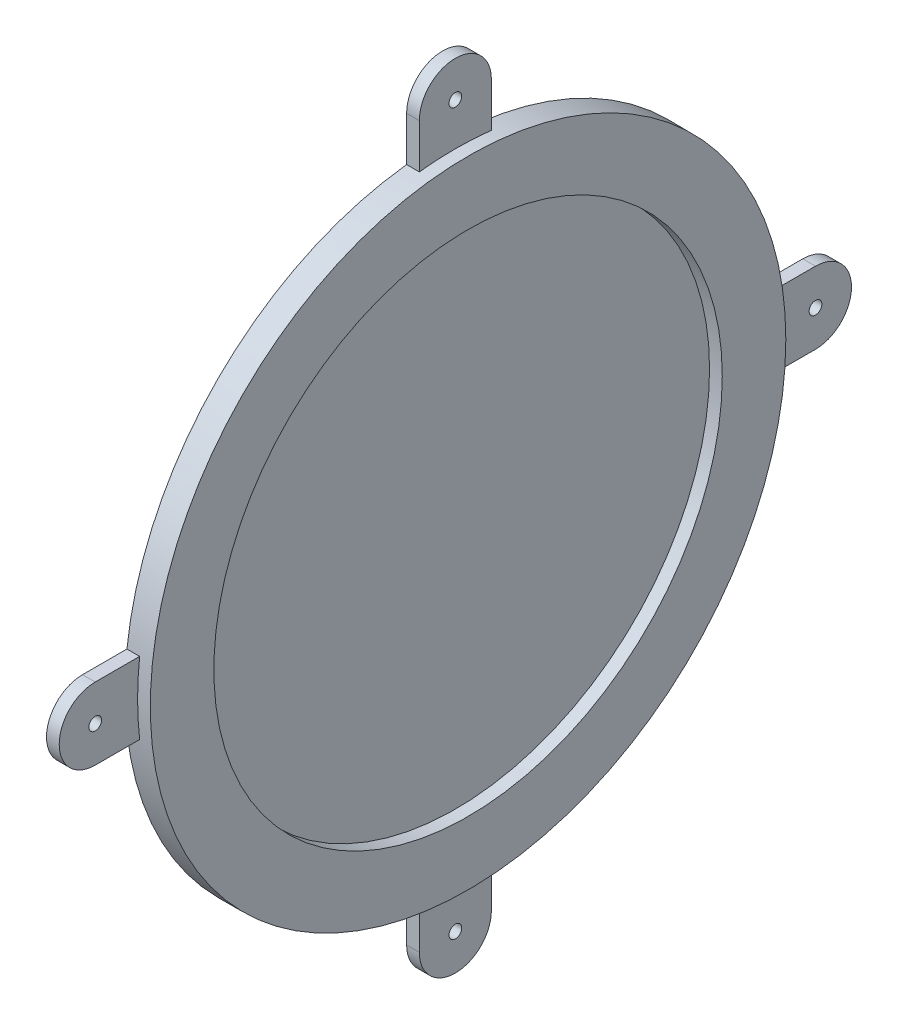
ISO-10303-21;
HEADER;
FILE_DESCRIPTION(('STEP AP214'),'2;1');
FILE_NAME('part.step','',(''),(''),'','','');
FILE_SCHEMA(('AUTOMOTIVE_DESIGN { 1 0 10303 214 1 1 1 1 }'));
ENDSEC;
DATA;
#1=APPLICATION_CONTEXT('core data for automotive mechanical design processes');
#2=APPLICATION_PROTOCOL_DEFINITION('international standard','automotive_design',2000,#1);
#3=PRODUCT_CONTEXT('',#1,'mechanical');
#4=PRODUCT('Part','Part','',(#3));
#5=PRODUCT_RELATED_PRODUCT_CATEGORY('part','',(#4));
#6=PRODUCT_DEFINITION_FORMATION('','',#4);
#7=PRODUCT_DEFINITION_CONTEXT('part definition',#1,'design');
#8=PRODUCT_DEFINITION('design','',#6,#7);
#9=PRODUCT_DEFINITION_SHAPE('','',#8);
#10=(LENGTH_UNIT() NAMED_UNIT(*) SI_UNIT(.MILLI.,.METRE.));
#11=(NAMED_UNIT(*) PLANE_ANGLE_UNIT() SI_UNIT($,.RADIAN.));
#12=(NAMED_UNIT(*) SI_UNIT($,.STERADIAN.) SOLID_ANGLE_UNIT());
#13=UNCERTAINTY_MEASURE_WITH_UNIT(LENGTH_MEASURE(1.E-05),#10,'distance_accuracy_value','');
#14=(GEOMETRIC_REPRESENTATION_CONTEXT(3) GLOBAL_UNCERTAINTY_ASSIGNED_CONTEXT((#13)) GLOBAL_UNIT_ASSIGNED_CONTEXT((#10,
#11,#12)) REPRESENTATION_CONTEXT('',''));
#15=CARTESIAN_POINT('',(0.,0.,0.));
#16=DIRECTION('',(0.,0.,1.));
#17=DIRECTION('',(1.,0.,0.));
#18=AXIS2_PLACEMENT_3D('',#15,#16,#17);
#19=CARTESIAN_POINT('',(3.,0.,0.));
#20=DIRECTION('',(1.,0.,0.));
#21=DIRECTION('',(0.,0.,-1.));
#22=AXIS2_PLACEMENT_3D('',#19,#20,#21);
#23=PLANE('',#22);
#24=CARTESIAN_POINT('',(3.,0.,0.));
#25=DIRECTION('',(1.,0.,0.));
#26=DIRECTION('',(0.,0.,-1.));
#27=AXIS2_PLACEMENT_3D('',#24,#25,#26);
#28=CIRCLE('',#27,75.0000000000023);
#29=CARTESIAN_POINT('',(3.,74.5167766345271,-8.5));
#30=VERTEX_POINT('',#29);
#31=CARTESIAN_POINT('',(3.,74.5167766345271,8.5));
#32=VERTEX_POINT('',#31);
#33=EDGE_CURVE('E11',#30,#32,#28,.T.);
#34=ORIENTED_EDGE('',*,*,#33,.F.);
#35=DIRECTION('',(0.,-1.,0.));
#36=VECTOR('',#35,1.);
#37=CARTESIAN_POINT('',(3.,-4.89478461256207E-13,-8.49999999999571));
#38=LINE('',#37,#36);
#39=CARTESIAN_POINT('',(3.,85.,-8.50000000000061));
#40=VERTEX_POINT('',#39);
#41=EDGE_CURVE('E248',#40,#30,#38,.T.);
#42=ORIENTED_EDGE('',*,*,#41,.F.);
#43=CARTESIAN_POINT('',(3.,85.,-5.98756576499627E-13));
#44=DIRECTION('',(1.,0.,0.));
#45=DIRECTION('',(0.,0.,-1.));
#46=AXIS2_PLACEMENT_3D('',#43,#44,#45);
#47=CIRCLE('',#46,8.5000000000003);
#48=CARTESIAN_POINT('',(3.,85.,8.5));
#49=VERTEX_POINT('',#48);
#50=EDGE_CURVE('E297',#40,#49,#47,.T.);
#51=ORIENTED_EDGE('',*,*,#50,.T.);
#52=DIRECTION('',(0.,-1.,0.));
#53=VECTOR('',#52,1.);
#54=CARTESIAN_POINT('',(3.,0.,8.5));
#55=LINE('',#54,#53);
#56=EDGE_CURVE('E295',#49,#32,#55,.T.);
#57=ORIENTED_EDGE('',*,*,#56,.T.);
#58=EDGE_LOOP('',(#34,#42,#51,#57));
#59=FACE_BOUND('',#58,.T.);
#60=CARTESIAN_POINT('',(3.,85.,-5.98756576499627E-13));
#61=DIRECTION('',(1.,0.,0.));
#62=DIRECTION('',(0.,0.,-1.));
#63=AXIS2_PLACEMENT_3D('',#60,#61,#62);
#64=CIRCLE('',#63,1.49999999999943);
#65=CARTESIAN_POINT('',(3.,85.,-1.50000000000003));
#66=VERTEX_POINT('',#65);
#67=EDGE_CURVE('E198',#66,#66,#64,.T.);
#68=ORIENTED_EDGE('',*,*,#67,.F.);
#69=EDGE_LOOP('',(#68));
#70=FACE_BOUND('',#69,.T.);
#71=ADVANCED_FACE('F38',(#59,#70),#23,.T.);
#72=CARTESIAN_POINT('',(3.,8.49999999999278,74.5167766345232));
#73=VERTEX_POINT('',#72);
#74=CARTESIAN_POINT('',(3.,-8.50000000000815,74.5167766345224));
#75=VERTEX_POINT('',#74);
#76=EDGE_CURVE('E48',#73,#75,#28,.T.);
#77=ORIENTED_EDGE('',*,*,#76,.F.);
#78=DIRECTION('',(0.,0.,-1.));
#79=VECTOR('',#78,1.);
#80=CARTESIAN_POINT('',(3.,8.49999999999213,0.));
#81=LINE('',#80,#79);
#82=CARTESIAN_POINT('',(3.,8.49999999999227,84.9999999999917));
#83=VERTEX_POINT('',#82);
#84=EDGE_CURVE('E296',#83,#73,#81,.T.);
#85=ORIENTED_EDGE('',*,*,#84,.F.);
#86=CARTESIAN_POINT('',(3.,-7.73818798504058E-12,84.9999999999917));
#87=DIRECTION('',(1.,0.,0.));
#88=DIRECTION('',(0.,0.,-1.));
#89=AXIS2_PLACEMENT_3D('',#86,#87,#88);
#90=CIRCLE('',#89,8.49999999999999);
#91=CARTESIAN_POINT('',(3.,-8.50000000000771,84.9999999999917));
#92=VERTEX_POINT('',#91);
#93=EDGE_CURVE('E300',#83,#92,#90,.T.);
#94=ORIENTED_EDGE('',*,*,#93,.T.);
#95=DIRECTION('',(0.,0.,-1.));
#96=VECTOR('',#95,1.);
#97=CARTESIAN_POINT('',(3.,-8.50000000000786,0.));
#98=LINE('',#97,#96);
#99=EDGE_CURVE('E306',#92,#75,#98,.T.);
#100=ORIENTED_EDGE('',*,*,#99,.T.);
#101=EDGE_LOOP('',(#77,#85,#94,#100));
#102=FACE_BOUND('',#101,.T.);
#103=CARTESIAN_POINT('',(3.,-7.73818798504058E-12,84.9999999999917));
#104=DIRECTION('',(1.,0.,0.));
#105=DIRECTION('',(0.,0.,-1.));
#106=AXIS2_PLACEMENT_3D('',#103,#104,#105);
#107=CIRCLE('',#106,1.50000000001069);
#108=CARTESIAN_POINT('',(3.,-7.73818798504058E-12,83.499999999981));
#109=VERTEX_POINT('',#108);
#110=EDGE_CURVE('E195',#109,#109,#107,.T.);
#111=ORIENTED_EDGE('',*,*,#110,.F.);
#112=EDGE_LOOP('',(#111));
#113=FACE_BOUND('',#112,.T.);
#114=ADVANCED_FACE('F354',(#102,#113),#23,.T.);
#115=CARTESIAN_POINT('',(3.,-74.5167766345279,8.49999999998404));
#116=VERTEX_POINT('',#115);
#117=CARTESIAN_POINT('',(3.,-74.5167766345262,-8.50000000001596));
#118=VERTEX_POINT('',#117);
#119=EDGE_CURVE('E169',#116,#118,#28,.T.);
#120=ORIENTED_EDGE('',*,*,#119,.F.);
#121=DIRECTION('',(0.,1.,0.));
#122=VECTOR('',#121,1.);
#123=CARTESIAN_POINT('',(3.,0.,8.4999999999838));
#124=LINE('',#123,#122);
#125=CARTESIAN_POINT('',(3.,-85.,8.49999999998394));
#126=VERTEX_POINT('',#125);
#127=EDGE_CURVE('E308',#126,#116,#124,.T.);
#128=ORIENTED_EDGE('',*,*,#127,.F.);
#129=CARTESIAN_POINT('',(3.,-85.,-1.60649982906703E-11));
#130=DIRECTION('',(1.,0.,0.));
#131=DIRECTION('',(0.,0.,-1.));
#132=AXIS2_PLACEMENT_3D('',#129,#130,#131);
#133=CIRCLE('',#132,8.49999999999999);
#134=CARTESIAN_POINT('',(3.,-85.,-8.50000000001604));
#135=VERTEX_POINT('',#134);
#136=EDGE_CURVE('E187',#126,#135,#133,.T.);
#137=ORIENTED_EDGE('',*,*,#136,.T.);
#138=DIRECTION('',(0.,1.,0.));
#139=VECTOR('',#138,1.);
#140=CARTESIAN_POINT('',(3.,0.,-8.5000000000162));
#141=LINE('',#140,#139);
#142=EDGE_CURVE('E184',#135,#118,#141,.T.);
#143=ORIENTED_EDGE('',*,*,#142,.T.);
#144=EDGE_LOOP('',(#120,#128,#137,#143));
#145=FACE_BOUND('',#144,.T.);
#146=CARTESIAN_POINT('',(3.,-85.,-1.60649982906703E-11));
#147=DIRECTION('',(1.,0.,0.));
#148=DIRECTION('',(0.,0.,-1.));
#149=AXIS2_PLACEMENT_3D('',#146,#147,#148);
#150=CIRCLE('',#149,1.50000000001593);
#151=CARTESIAN_POINT('',(3.,-85.,-1.500000000032));
#152=VERTEX_POINT('',#151);
#153=EDGE_CURVE('E192',#152,#152,#150,.T.);
#154=ORIENTED_EDGE('',*,*,#153,.F.);
#155=EDGE_LOOP('',(#154));
#156=FACE_BOUND('',#155,.T.);
#157=ADVANCED_FACE('F314',(#145,#156),#23,.T.);
#158=CARTESIAN_POINT('',(3.,-4.89478461256207E-13,-8.49999999999571));
#159=DIRECTION('',(0.,0.,-1.));
#160=DIRECTION('',(0.,1.,0.));
#161=AXIS2_PLACEMENT_3D('',#158,#159,#160);
#162=PLANE('',#161);
#163=DIRECTION('',(0.,-1.,0.));
#164=VECTOR('',#163,1.);
#165=CARTESIAN_POINT('',(0.,-4.89478461256207E-13,-8.49999999999571));
#166=LINE('',#165,#164);
#167=CARTESIAN_POINT('',(0.,85.,-8.50000000000061));
#168=VERTEX_POINT('',#167);
#169=CARTESIAN_POINT('',(0.,74.5167766345271,-8.5));
#170=VERTEX_POINT('',#169);
#171=EDGE_CURVE('E208',#168,#170,#166,.T.);
#172=ORIENTED_EDGE('',*,*,#171,.F.);
#173=DIRECTION('',(-1.,0.,0.));
#174=VECTOR('',#173,1.);
#175=CARTESIAN_POINT('',(3.,85.,-8.50000000000061));
#176=LINE('',#175,#174);
#177=EDGE_CURVE('E276',#40,#168,#176,.T.);
#178=ORIENTED_EDGE('',*,*,#177,.F.);
#179=ORIENTED_EDGE('',*,*,#41,.T.);
#180=DIRECTION('',(-1.,0.,0.));
#181=VECTOR('',#180,1.);
#182=CARTESIAN_POINT('',(3.,74.5167766345271,-8.5));
#183=LINE('',#182,#181);
#184=EDGE_CURVE('E42',#30,#170,#183,.T.);
#185=ORIENTED_EDGE('',*,*,#184,.T.);
#186=EDGE_LOOP('',(#172,#178,#179,#185));
#187=FACE_BOUND('',#186,.T.);
#188=ADVANCED_FACE('F40',(#187),#162,.T.);
#189=CARTESIAN_POINT('',(3.,85.,-5.98756576499627E-13));
#190=DIRECTION('',(-1.,0.,0.));
#191=DIRECTION('',(0.,0.,1.));
#192=AXIS2_PLACEMENT_3D('',#189,#190,#191);
#193=CYLINDRICAL_SURFACE('',#192,8.5000000000003);
#194=CARTESIAN_POINT('',(0.,85.,-5.98756576499627E-13));
#195=DIRECTION('',(1.,0.,0.));
#196=DIRECTION('',(0.,0.,-1.));
#197=AXIS2_PLACEMENT_3D('',#194,#195,#196);
#198=CIRCLE('',#197,8.5000000000003);
#199=CARTESIAN_POINT('',(0.,85.,8.5));
#200=VERTEX_POINT('',#199);
#201=EDGE_CURVE('E213',#168,#200,#198,.T.);
#202=ORIENTED_EDGE('',*,*,#201,.T.);
#203=DIRECTION('',(-1.,0.,0.));
#204=VECTOR('',#203,1.);
#205=CARTESIAN_POINT('',(3.,85.,8.5));
#206=LINE('',#205,#204);
#207=EDGE_CURVE('E274',#49,#200,#206,.T.);
#208=ORIENTED_EDGE('',*,*,#207,.F.);
#209=ORIENTED_EDGE('',*,*,#50,.F.);
#210=ORIENTED_EDGE('',*,*,#177,.T.);
#211=EDGE_LOOP('',(#202,#208,#209,#210));
#212=FACE_BOUND('',#211,.T.);
#213=ADVANCED_FACE('F290',(#212),#193,.T.);
#214=CARTESIAN_POINT('',(3.,0.,8.5));
#215=DIRECTION('',(0.,0.,-1.));
#216=DIRECTION('',(-1.,0.,0.));
#217=AXIS2_PLACEMENT_3D('',#214,#215,#216);
#218=PLANE('',#217);
#219=DIRECTION('',(0.,-1.,0.));
#220=VECTOR('',#219,1.);
#221=CARTESIAN_POINT('',(0.,0.,8.5));
#222=LINE('',#221,#220);
#223=CARTESIAN_POINT('',(0.,74.5167766345271,8.5));
#224=VERTEX_POINT('',#223);
#225=EDGE_CURVE('E215',#200,#224,#222,.T.);
#226=ORIENTED_EDGE('',*,*,#225,.T.);
#227=DIRECTION('',(-1.,0.,0.));
#228=VECTOR('',#227,1.);
#229=CARTESIAN_POINT('',(3.,74.5167766345271,8.5));
#230=LINE('',#229,#228);
#231=EDGE_CURVE('E271',#32,#224,#230,.T.);
#232=ORIENTED_EDGE('',*,*,#231,.F.);
#233=ORIENTED_EDGE('',*,*,#56,.F.);
#234=ORIENTED_EDGE('',*,*,#207,.T.);
#235=EDGE_LOOP('',(#226,#232,#233,#234));
#236=FACE_BOUND('',#235,.T.);
#237=ADVANCED_FACE('F293',(#236),#218,.F.);
#238=CARTESIAN_POINT('',(3.,8.49999999999213,0.));
#239=DIRECTION('',(0.,1.,0.));
#240=DIRECTION('',(0.,0.,1.));
#241=AXIS2_PLACEMENT_3D('',#238,#239,#240);
#242=PLANE('',#241);
#243=DIRECTION('',(0.,0.,-1.));
#244=VECTOR('',#243,1.);
#245=CARTESIAN_POINT('',(0.,8.49999999999213,0.));
#246=LINE('',#245,#244);
#247=CARTESIAN_POINT('',(0.,8.49999999999227,84.9999999999917));
#248=VERTEX_POINT('',#247);
#249=CARTESIAN_POINT('',(0.,8.49999999999278,74.5167766345232));
#250=VERTEX_POINT('',#249);
#251=EDGE_CURVE('E217',#248,#250,#246,.T.);
#252=ORIENTED_EDGE('',*,*,#251,.F.);
#253=DIRECTION('',(-1.,0.,0.));
#254=VECTOR('',#253,1.);
#255=CARTESIAN_POINT('',(3.,8.49999999999227,84.9999999999917));
#256=LINE('',#255,#254);
#257=EDGE_CURVE('E267',#83,#248,#256,.T.);
#258=ORIENTED_EDGE('',*,*,#257,.F.);
#259=ORIENTED_EDGE('',*,*,#84,.T.);
#260=DIRECTION('',(-1.,0.,0.));
#261=VECTOR('',#260,1.);
#262=CARTESIAN_POINT('',(3.,8.49999999999278,74.5167766345232));
#263=LINE('',#262,#261);
#264=EDGE_CURVE('E269',#73,#250,#263,.T.);
#265=ORIENTED_EDGE('',*,*,#264,.T.);
#266=EDGE_LOOP('',(#252,#258,#259,#265));
#267=FACE_BOUND('',#266,.T.);
#268=ADVANCED_FACE('F382',(#267),#242,.T.);
#269=CARTESIAN_POINT('',(3.,-7.73818798504058E-12,84.9999999999917));
#270=DIRECTION('',(-1.,0.,0.));
#271=DIRECTION('',(0.,0.,1.));
#272=AXIS2_PLACEMENT_3D('',#269,#270,#271);
#273=CYLINDRICAL_SURFACE('',#272,8.49999999999999);
#274=CARTESIAN_POINT('',(0.,-7.73818798504058E-12,84.9999999999917));
#275=DIRECTION('',(1.,0.,0.));
#276=DIRECTION('',(0.,0.,-1.));
#277=AXIS2_PLACEMENT_3D('',#274,#275,#276);
#278=CIRCLE('',#277,8.49999999999999);
#279=CARTESIAN_POINT('',(0.,-8.50000000000771,84.9999999999917));
#280=VERTEX_POINT('',#279);
#281=EDGE_CURVE('E220',#248,#280,#278,.T.);
#282=ORIENTED_EDGE('',*,*,#281,.T.);
#283=DIRECTION('',(-1.,0.,0.));
#284=VECTOR('',#283,1.);
#285=CARTESIAN_POINT('',(3.,-8.50000000000771,84.9999999999917));
#286=LINE('',#285,#284);
#287=EDGE_CURVE('E264',#92,#280,#286,.T.);
#288=ORIENTED_EDGE('',*,*,#287,.F.);
#289=ORIENTED_EDGE('',*,*,#93,.F.);
#290=ORIENTED_EDGE('',*,*,#257,.T.);
#291=EDGE_LOOP('',(#282,#288,#289,#290));
#292=FACE_BOUND('',#291,.T.);
#293=ADVANCED_FACE('F387',(#292),#273,.T.);
#294=CARTESIAN_POINT('',(3.,-8.50000000000786,0.));
#295=DIRECTION('',(0.,1.,0.));
#296=DIRECTION('',(0.,0.,1.));
#297=AXIS2_PLACEMENT_3D('',#294,#295,#296);
#298=PLANE('',#297);
#299=DIRECTION('',(0.,0.,-1.));
#300=VECTOR('',#299,1.);
#301=CARTESIAN_POINT('',(0.,-8.50000000000786,0.));
#302=LINE('',#301,#300);
#303=CARTESIAN_POINT('',(0.,-8.50000000000815,74.5167766345224));
#304=VERTEX_POINT('',#303);
#305=EDGE_CURVE('E222',#280,#304,#302,.T.);
#306=ORIENTED_EDGE('',*,*,#305,.T.);
#307=DIRECTION('',(-1.,0.,0.));
#308=VECTOR('',#307,1.);
#309=CARTESIAN_POINT('',(3.,-8.50000000000815,74.5167766345224));
#310=LINE('',#309,#308);
#311=EDGE_CURVE('E261',#75,#304,#310,.T.);
#312=ORIENTED_EDGE('',*,*,#311,.F.);
#313=ORIENTED_EDGE('',*,*,#99,.F.);
#314=ORIENTED_EDGE('',*,*,#287,.T.);
#315=EDGE_LOOP('',(#306,#312,#313,#314));
#316=FACE_BOUND('',#315,.T.);
#317=ADVANCED_FACE('F391',(#316),#298,.F.);
#318=CARTESIAN_POINT('',(3.,0.,8.4999999999838));
#319=DIRECTION('',(0.,0.,1.));
#320=DIRECTION('',(0.,-1.,0.));
#321=AXIS2_PLACEMENT_3D('',#318,#319,#320);
#322=PLANE('',#321);
#323=DIRECTION('',(0.,1.,0.));
#324=VECTOR('',#323,1.);
#325=CARTESIAN_POINT('',(0.,0.,8.4999999999838));
#326=LINE('',#325,#324);
#327=CARTESIAN_POINT('',(0.,-85.,8.49999999998394));
#328=VERTEX_POINT('',#327);
#329=CARTESIAN_POINT('',(0.,-74.5167766345279,8.49999999998404));
#330=VERTEX_POINT('',#329);
#331=EDGE_CURVE('E225',#328,#330,#326,.T.);
#332=ORIENTED_EDGE('',*,*,#331,.F.);
#333=DIRECTION('',(-1.,0.,0.));
#334=VECTOR('',#333,1.);
#335=CARTESIAN_POINT('',(3.,-85.,8.49999999998394));
#336=LINE('',#335,#334);
#337=EDGE_CURVE('E257',#126,#328,#336,.T.);
#338=ORIENTED_EDGE('',*,*,#337,.F.);
#339=ORIENTED_EDGE('',*,*,#127,.T.);
#340=DIRECTION('',(-1.,0.,0.));
#341=VECTOR('',#340,1.);
#342=CARTESIAN_POINT('',(3.,-74.5167766345279,8.49999999998404));
#343=LINE('',#342,#341);
#344=EDGE_CURVE('E259',#116,#330,#343,.T.);
#345=ORIENTED_EDGE('',*,*,#344,.T.);
#346=EDGE_LOOP('',(#332,#338,#339,#345));
#347=FACE_BOUND('',#346,.T.);
#348=ADVANCED_FACE('F395',(#347),#322,.T.);
#349=CARTESIAN_POINT('',(3.,-85.,-1.60649982906703E-11));
#350=DIRECTION('',(-1.,0.,0.));
#351=DIRECTION('',(0.,0.,1.));
#352=AXIS2_PLACEMENT_3D('',#349,#350,#351);
#353=CYLINDRICAL_SURFACE('',#352,8.49999999999999);
#354=CARTESIAN_POINT('',(0.,-85.,-1.60649982906703E-11));
#355=DIRECTION('',(1.,0.,0.));
#356=DIRECTION('',(0.,0.,-1.));
#357=AXIS2_PLACEMENT_3D('',#354,#355,#356);
#358=CIRCLE('',#357,8.49999999999999);
#359=CARTESIAN_POINT('',(0.,-85.,-8.50000000001604));
#360=VERTEX_POINT('',#359);
#361=EDGE_CURVE('E228',#328,#360,#358,.T.);
#362=ORIENTED_EDGE('',*,*,#361,.T.);
#363=DIRECTION('',(-1.,0.,0.));
#364=VECTOR('',#363,1.);
#365=CARTESIAN_POINT('',(3.,-85.,-8.50000000001604));
#366=LINE('',#365,#364);
#367=EDGE_CURVE('E254',#135,#360,#366,.T.);
#368=ORIENTED_EDGE('',*,*,#367,.F.);
#369=ORIENTED_EDGE('',*,*,#136,.F.);
#370=ORIENTED_EDGE('',*,*,#337,.T.);
#371=EDGE_LOOP('',(#362,#368,#369,#370));
#372=FACE_BOUND('',#371,.T.);
#373=ADVANCED_FACE('F319',(#372),#353,.T.);
#374=CARTESIAN_POINT('',(3.,0.,-8.5000000000162));
#375=DIRECTION('',(0.,0.,1.));
#376=DIRECTION('',(0.,-1.,0.));
#377=AXIS2_PLACEMENT_3D('',#374,#375,#376);
#378=PLANE('',#377);
#379=DIRECTION('',(0.,1.,0.));
#380=VECTOR('',#379,1.);
#381=CARTESIAN_POINT('',(0.,0.,-8.5000000000162));
#382=LINE('',#381,#380);
#383=CARTESIAN_POINT('',(0.,-74.5167766345262,-8.50000000001596));
#384=VERTEX_POINT('',#383);
#385=EDGE_CURVE('E230',#360,#384,#382,.T.);
#386=ORIENTED_EDGE('',*,*,#385,.T.);
#387=DIRECTION('',(-1.,0.,0.));
#388=VECTOR('',#387,1.);
#389=CARTESIAN_POINT('',(3.,-74.5167766345262,-8.50000000001596));
#390=LINE('',#389,#388);
#391=EDGE_CURVE('E180',#118,#384,#390,.T.);
#392=ORIENTED_EDGE('',*,*,#391,.F.);
#393=ORIENTED_EDGE('',*,*,#142,.F.);
#394=ORIENTED_EDGE('',*,*,#367,.T.);
#395=EDGE_LOOP('',(#386,#392,#393,#394));
#396=FACE_BOUND('',#395,.T.);
#397=ADVANCED_FACE('F323',(#396),#378,.F.);
#398=CARTESIAN_POINT('',(3.,0.,0.));
#399=DIRECTION('',(-1.,0.,0.));
#400=DIRECTION('',(0.,0.,1.));
#401=AXIS2_PLACEMENT_3D('',#398,#399,#400);
#402=CYLINDRICAL_SURFACE('',#401,75.);
#403=CARTESIAN_POINT('',(0.,0.,0.));
#404=DIRECTION('',(1.,0.,0.));
#405=DIRECTION('',(0.,0.,-1.));
#406=AXIS2_PLACEMENT_3D('',#403,#404,#405);
#407=CIRCLE('',#406,75.);
#408=CARTESIAN_POINT('',(0.,-8.49999999999184,-74.5167766345317));
#409=VERTEX_POINT('',#408);
#410=EDGE_CURVE('E176',#384,#409,#407,.T.);
#411=ORIENTED_EDGE('',*,*,#410,.T.);
#412=DIRECTION('',(-1.,0.,0.));
#413=VECTOR('',#412,1.);
#414=CARTESIAN_POINT('',(3.,-8.49999999999184,-74.5167766345317));
#415=LINE('',#414,#413);
#416=CARTESIAN_POINT('',(3.,-8.49999999999184,-74.5167766345317));
#417=VERTEX_POINT('',#416);
#418=EDGE_CURVE('E171',#417,#409,#415,.T.);
#419=ORIENTED_EDGE('',*,*,#418,.F.);
#420=CARTESIAN_POINT('',(3.,8.50000000000773,-74.5167766345285));
#421=VERTEX_POINT('',#420);
#422=EDGE_CURVE('E50',#417,#421,#28,.T.);
#423=ORIENTED_EDGE('',*,*,#422,.T.);
#424=DIRECTION('',(-1.,0.,0.));
#425=VECTOR('',#424,1.);
#426=CARTESIAN_POINT('',(3.,8.50000000000722,-74.5167766345309));
#427=LINE('',#426,#425);
#428=CARTESIAN_POINT('',(0.,8.50000000000722,-74.5167766345309));
#429=VERTEX_POINT('',#428);
#430=EDGE_CURVE('E204',#421,#429,#427,.T.);
#431=ORIENTED_EDGE('',*,*,#430,.T.);
#432=EDGE_CURVE('E205',#429,#170,#407,.T.);
#433=ORIENTED_EDGE('',*,*,#432,.T.);
#434=ORIENTED_EDGE('',*,*,#184,.F.);
#435=ORIENTED_EDGE('',*,*,#33,.T.);
#436=ORIENTED_EDGE('',*,*,#231,.T.);
#437=EDGE_CURVE('E210',#224,#250,#407,.T.);
#438=ORIENTED_EDGE('',*,*,#437,.T.);
#439=ORIENTED_EDGE('',*,*,#264,.F.);
#440=ORIENTED_EDGE('',*,*,#76,.T.);
#441=ORIENTED_EDGE('',*,*,#311,.T.);
#442=EDGE_CURVE('E224',#304,#330,#407,.T.);
#443=ORIENTED_EDGE('',*,*,#442,.T.);
#444=ORIENTED_EDGE('',*,*,#344,.F.);
#445=ORIENTED_EDGE('',*,*,#119,.T.);
#446=ORIENTED_EDGE('',*,*,#391,.T.);
#447=EDGE_LOOP('',(#411,#419,#423,#431,#433,#434,#435,#436,#438,#439,#440,#441,#443,#444,#445,#446));
#448=FACE_BOUND('',#447,.T.);
#449=CARTESIAN_POINT('',(6.,0.,0.));
#450=DIRECTION('',(1.,0.,0.));
#451=DIRECTION('',(0.,0.,-1.));
#452=AXIS2_PLACEMENT_3D('',#449,#450,#451);
#453=CIRCLE('',#452,75.0000000000023);
#454=CARTESIAN_POINT('',(6.,0.,-75.0000000000023));
#455=VERTEX_POINT('',#454);
#456=EDGE_CURVE('E209',#455,#455,#453,.T.);
#457=ORIENTED_EDGE('',*,*,#456,.F.);
#458=EDGE_LOOP('',(#457));
#459=FACE_BOUND('',#458,.T.);
#460=ADVANCED_FACE('F172',(#448,#459),#402,.T.);
#461=CARTESIAN_POINT('',(3.,-8.49999999999211,0.));
#462=DIRECTION('',(0.,-1.,0.));
#463=DIRECTION('',(0.,0.,-1.));
#464=AXIS2_PLACEMENT_3D('',#461,#462,#463);
#465=PLANE('',#464);
#466=DIRECTION('',(0.,0.,1.));
#467=VECTOR('',#466,1.);
#468=CARTESIAN_POINT('',(0.,-8.49999999999211,0.));
#469=LINE('',#468,#467);
#470=CARTESIAN_POINT('',(0.,-8.49999999999227,-85.0000000000083));
#471=VERTEX_POINT('',#470);
#472=EDGE_CURVE('E232',#471,#409,#469,.T.);
#473=ORIENTED_EDGE('',*,*,#472,.F.);
#474=DIRECTION('',(-1.,0.,0.));
#475=VECTOR('',#474,1.);
#476=CARTESIAN_POINT('',(3.,-8.49999999999227,-85.0000000000083));
#477=LINE('',#476,#475);
#478=CARTESIAN_POINT('',(3.,-8.49999999999227,-85.0000000000083));
#479=VERTEX_POINT('',#478);
#480=EDGE_CURVE('E181',#479,#471,#477,.T.);
#481=ORIENTED_EDGE('',*,*,#480,.F.);
#482=DIRECTION('',(0.,0.,1.));
#483=VECTOR('',#482,1.);
#484=CARTESIAN_POINT('',(3.,-8.49999999999211,0.));
#485=LINE('',#484,#483);
#486=EDGE_CURVE('E165',#479,#417,#485,.T.);
#487=ORIENTED_EDGE('',*,*,#486,.T.);
#488=ORIENTED_EDGE('',*,*,#418,.T.);
#489=EDGE_LOOP('',(#473,#481,#487,#488));
#490=FACE_BOUND('',#489,.T.);
#491=ADVANCED_FACE('F183',(#490),#465,.T.);
#492=CARTESIAN_POINT('',(3.,7.73846322692284E-12,-85.0000000000083));
#493=DIRECTION('',(-1.,0.,0.));
#494=DIRECTION('',(0.,0.,1.));
#495=AXIS2_PLACEMENT_3D('',#492,#493,#494);
#496=CYLINDRICAL_SURFACE('',#495,8.49999999999999);
#497=CARTESIAN_POINT('',(0.,7.73846322692284E-12,-85.0000000000083));
#498=DIRECTION('',(1.,0.,0.));
#499=DIRECTION('',(0.,0.,-1.));
#500=AXIS2_PLACEMENT_3D('',#497,#498,#499);
#501=CIRCLE('',#500,8.49999999999999);
#502=CARTESIAN_POINT('',(0.,8.50000000000771,-85.0000000000083));
#503=VERTEX_POINT('',#502);
#504=EDGE_CURVE('E111',#471,#503,#501,.T.);
#505=ORIENTED_EDGE('',*,*,#504,.T.);
#506=DIRECTION('',(-1.,0.,0.));
#507=VECTOR('',#506,1.);
#508=CARTESIAN_POINT('',(3.,8.50000000000771,-85.0000000000083));
#509=LINE('',#508,#507);
#510=CARTESIAN_POINT('',(3.,8.50000000000771,-85.0000000000083));
#511=VERTEX_POINT('',#510);
#512=EDGE_CURVE('E250',#511,#503,#509,.T.);
#513=ORIENTED_EDGE('',*,*,#512,.F.);
#514=CARTESIAN_POINT('',(3.,7.73846322692284E-12,-85.0000000000083));
#515=DIRECTION('',(1.,0.,0.));
#516=DIRECTION('',(0.,0.,-1.));
#517=AXIS2_PLACEMENT_3D('',#514,#515,#516);
#518=CIRCLE('',#517,8.49999999999999);
#519=EDGE_CURVE('E58',#479,#511,#518,.T.);
#520=ORIENTED_EDGE('',*,*,#519,.F.);
#521=ORIENTED_EDGE('',*,*,#480,.T.);
#522=EDGE_LOOP('',(#505,#513,#520,#521));
#523=FACE_BOUND('',#522,.T.);
#524=ADVANCED_FACE('F408',(#523),#496,.T.);
#525=CARTESIAN_POINT('',(3.,85.,-5.98756576499627E-13));
#526=DIRECTION('',(-1.,0.,0.));
#527=DIRECTION('',(0.,0.,1.));
#528=AXIS2_PLACEMENT_3D('',#525,#526,#527);
#529=CYLINDRICAL_SURFACE('',#528,1.49999999999943);
#530=ORIENTED_EDGE('',*,*,#67,.T.);
#531=EDGE_LOOP('',(#530));
#532=FACE_BOUND('',#531,.T.);
#533=CARTESIAN_POINT('',(0.,85.,-5.98756576499627E-13));
#534=DIRECTION('',(1.,0.,0.));
#535=DIRECTION('',(0.,0.,-1.));
#536=AXIS2_PLACEMENT_3D('',#533,#534,#535);
#537=CIRCLE('',#536,1.49999999999943);
#538=CARTESIAN_POINT('',(0.,85.,-1.50000000000003));
#539=VERTEX_POINT('',#538);
#540=EDGE_CURVE('E242',#539,#539,#537,.T.);
#541=ORIENTED_EDGE('',*,*,#540,.F.);
#542=EDGE_LOOP('',(#541));
#543=FACE_BOUND('',#542,.T.);
#544=ADVANCED_FACE('F411',(#532,#543),#529,.F.);
#545=CARTESIAN_POINT('',(3.,-7.73818798504058E-12,84.9999999999917));
#546=DIRECTION('',(-1.,0.,0.));
#547=DIRECTION('',(0.,0.,1.));
#548=AXIS2_PLACEMENT_3D('',#545,#546,#547);
#549=CYLINDRICAL_SURFACE('',#548,1.50000000001069);
#550=ORIENTED_EDGE('',*,*,#110,.T.);
#551=EDGE_LOOP('',(#550));
#552=FACE_BOUND('',#551,.T.);
#553=CARTESIAN_POINT('',(0.,-7.73818798504058E-12,84.9999999999917));
#554=DIRECTION('',(1.,0.,0.));
#555=DIRECTION('',(0.,0.,-1.));
#556=AXIS2_PLACEMENT_3D('',#553,#554,#555);
#557=CIRCLE('',#556,1.50000000001069);
#558=CARTESIAN_POINT('',(0.,-7.73818798504058E-12,83.499999999981));
#559=VERTEX_POINT('',#558);
#560=EDGE_CURVE('E239',#559,#559,#557,.T.);
#561=ORIENTED_EDGE('',*,*,#560,.F.);
#562=EDGE_LOOP('',(#561));
#563=FACE_BOUND('',#562,.T.);
#564=ADVANCED_FACE('F417',(#552,#563),#549,.F.);
#565=CARTESIAN_POINT('',(3.,-85.,-1.60649982906703E-11));
#566=DIRECTION('',(-1.,0.,0.));
#567=DIRECTION('',(0.,0.,1.));
#568=AXIS2_PLACEMENT_3D('',#565,#566,#567);
#569=CYLINDRICAL_SURFACE('',#568,1.50000000001593);
#570=ORIENTED_EDGE('',*,*,#153,.T.);
#571=EDGE_LOOP('',(#570));
#572=FACE_BOUND('',#571,.T.);
#573=CARTESIAN_POINT('',(0.,-85.,-1.60649982906703E-11));
#574=DIRECTION('',(1.,0.,0.));
#575=DIRECTION('',(0.,0.,-1.));
#576=AXIS2_PLACEMENT_3D('',#573,#574,#575);
#577=CIRCLE('',#576,1.50000000001593);
#578=CARTESIAN_POINT('',(0.,-85.,-1.500000000032));
#579=VERTEX_POINT('',#578);
#580=EDGE_CURVE('E236',#579,#579,#577,.T.);
#581=ORIENTED_EDGE('',*,*,#580,.F.);
#582=EDGE_LOOP('',(#581));
#583=FACE_BOUND('',#582,.T.);
#584=ADVANCED_FACE('F414',(#572,#583),#569,.F.);
#585=CARTESIAN_POINT('',(3.,8.50000000000788,0.));
#586=DIRECTION('',(0.,-1.,0.));
#587=DIRECTION('',(0.,0.,-1.));
#588=AXIS2_PLACEMENT_3D('',#585,#586,#587);
#589=PLANE('',#588);
#590=DIRECTION('',(0.,0.,1.));
#591=VECTOR('',#590,1.);
#592=CARTESIAN_POINT('',(0.,8.50000000000788,0.));
#593=LINE('',#592,#591);
#594=EDGE_CURVE('E118',#503,#429,#593,.T.);
#595=ORIENTED_EDGE('',*,*,#594,.T.);
#596=ORIENTED_EDGE('',*,*,#430,.F.);
#597=DIRECTION('',(0.,0.,1.));
#598=VECTOR('',#597,1.);
#599=CARTESIAN_POINT('',(3.,8.50000000000788,0.));
#600=LINE('',#599,#598);
#601=EDGE_CURVE('E167',#511,#421,#600,.T.);
#602=ORIENTED_EDGE('',*,*,#601,.F.);
#603=ORIENTED_EDGE('',*,*,#512,.T.);
#604=EDGE_LOOP('',(#595,#596,#602,#603));
#605=FACE_BOUND('',#604,.T.);
#606=ADVANCED_FACE('F365',(#605),#589,.F.);
#607=CARTESIAN_POINT('',(3.,7.73846322692284E-12,-85.0000000000083));
#608=DIRECTION('',(-1.,0.,0.));
#609=DIRECTION('',(0.,0.,1.));
#610=AXIS2_PLACEMENT_3D('',#607,#608,#609);
#611=CYLINDRICAL_SURFACE('',#610,1.50000000000525);
#612=CARTESIAN_POINT('',(3.,7.73846322692284E-12,-85.0000000000083));
#613=DIRECTION('',(1.,0.,0.));
#614=DIRECTION('',(0.,0.,-1.));
#615=AXIS2_PLACEMENT_3D('',#612,#613,#614);
#616=CIRCLE('',#615,1.50000000000525);
#617=CARTESIAN_POINT('',(3.,7.73846322692284E-12,-86.5000000000136));
#618=VERTEX_POINT('',#617);
#619=EDGE_CURVE('E201',#618,#618,#616,.T.);
#620=ORIENTED_EDGE('',*,*,#619,.T.);
#621=EDGE_LOOP('',(#620));
#622=FACE_BOUND('',#621,.T.);
#623=CARTESIAN_POINT('',(0.,7.73846322692284E-12,-85.0000000000083));
#624=DIRECTION('',(1.,0.,0.));
#625=DIRECTION('',(0.,0.,-1.));
#626=AXIS2_PLACEMENT_3D('',#623,#624,#625);
#627=CIRCLE('',#626,1.50000000000525);
#628=CARTESIAN_POINT('',(0.,7.73846322692284E-12,-86.5000000000136));
#629=VERTEX_POINT('',#628);
#630=EDGE_CURVE('E245',#629,#629,#627,.T.);
#631=ORIENTED_EDGE('',*,*,#630,.F.);
#632=EDGE_LOOP('',(#631));
#633=FACE_BOUND('',#632,.T.);
#634=ADVANCED_FACE('F361',(#622,#633),#611,.F.);
#635=ORIENTED_EDGE('',*,*,#422,.F.);
#636=ORIENTED_EDGE('',*,*,#486,.F.);
#637=ORIENTED_EDGE('',*,*,#519,.T.);
#638=ORIENTED_EDGE('',*,*,#601,.T.);
#639=EDGE_LOOP('',(#635,#636,#637,#638));
#640=FACE_BOUND('',#639,.T.);
#641=ORIENTED_EDGE('',*,*,#619,.F.);
#642=EDGE_LOOP('',(#641));
#643=FACE_BOUND('',#642,.T.);
#644=ADVANCED_FACE('F162',(#640,#643),#23,.T.);
#645=CARTESIAN_POINT('',(0.,0.,0.));
#646=DIRECTION('',(1.,0.,0.));
#647=DIRECTION('',(0.,0.,-1.));
#648=AXIS2_PLACEMENT_3D('',#645,#646,#647);
#649=PLANE('',#648);
#650=ORIENTED_EDGE('',*,*,#432,.F.);
#651=ORIENTED_EDGE('',*,*,#594,.F.);
#652=ORIENTED_EDGE('',*,*,#504,.F.);
#653=ORIENTED_EDGE('',*,*,#472,.T.);
#654=ORIENTED_EDGE('',*,*,#410,.F.);
#655=ORIENTED_EDGE('',*,*,#385,.F.);
#656=ORIENTED_EDGE('',*,*,#361,.F.);
#657=ORIENTED_EDGE('',*,*,#331,.T.);
#658=ORIENTED_EDGE('',*,*,#442,.F.);
#659=ORIENTED_EDGE('',*,*,#305,.F.);
#660=ORIENTED_EDGE('',*,*,#281,.F.);
#661=ORIENTED_EDGE('',*,*,#251,.T.);
#662=ORIENTED_EDGE('',*,*,#437,.F.);
#663=ORIENTED_EDGE('',*,*,#225,.F.);
#664=ORIENTED_EDGE('',*,*,#201,.F.);
#665=ORIENTED_EDGE('',*,*,#171,.T.);
#666=EDGE_LOOP('',(#650,#651,#652,#653,#654,#655,#656,#657,#658,#659,#660,#661,#662,#663,#664,#665));
#667=FACE_BOUND('',#666,.T.);
#668=ORIENTED_EDGE('',*,*,#580,.T.);
#669=EDGE_LOOP('',(#668));
#670=FACE_BOUND('',#669,.T.);
#671=ORIENTED_EDGE('',*,*,#560,.T.);
#672=EDGE_LOOP('',(#671));
#673=FACE_BOUND('',#672,.T.);
#674=ORIENTED_EDGE('',*,*,#540,.T.);
#675=EDGE_LOOP('',(#674));
#676=FACE_BOUND('',#675,.T.);
#677=ORIENTED_EDGE('',*,*,#630,.T.);
#678=EDGE_LOOP('',(#677));
#679=FACE_BOUND('',#678,.T.);
#680=ADVANCED_FACE('F285',(#667,#670,#673,#676,#679),#649,.F.);
#681=CARTESIAN_POINT('',(6.,0.,0.));
#682=DIRECTION('',(1.,0.,0.));
#683=DIRECTION('',(0.,0.,-1.));
#684=AXIS2_PLACEMENT_3D('',#681,#682,#683);
#685=PLANE('',#684);
#686=ORIENTED_EDGE('',*,*,#456,.T.);
#687=EDGE_LOOP('',(#686));
#688=FACE_BOUND('',#687,.T.);
#689=CARTESIAN_POINT('',(6.,0.,0.));
#690=DIRECTION('',(1.,0.,0.));
#691=DIRECTION('',(0.,0.,-1.));
#692=AXIS2_PLACEMENT_3D('',#689,#690,#691);
#693=CIRCLE('',#692,60.);
#694=CARTESIAN_POINT('',(6.,0.,-60.));
#695=VERTEX_POINT('',#694);
#696=EDGE_CURVE('E331',#695,#695,#693,.T.);
#697=ORIENTED_EDGE('',*,*,#696,.F.);
#698=EDGE_LOOP('',(#697));
#699=FACE_BOUND('',#698,.T.);
#700=ADVANCED_FACE('F341',(#688,#699),#685,.T.);
#701=CARTESIAN_POINT('',(6.,0.,0.));
#702=DIRECTION('',(-1.,0.,0.));
#703=DIRECTION('',(0.,0.,1.));
#704=AXIS2_PLACEMENT_3D('',#701,#702,#703);
#705=CYLINDRICAL_SURFACE('',#704,60.);
#706=ORIENTED_EDGE('',*,*,#696,.T.);
#707=EDGE_LOOP('',(#706));
#708=FACE_BOUND('',#707,.T.);
#709=CARTESIAN_POINT('',(3.,0.,0.));
#710=DIRECTION('',(1.,0.,0.));
#711=DIRECTION('',(0.,0.,-1.));
#712=AXIS2_PLACEMENT_3D('',#709,#710,#711);
#713=CIRCLE('',#712,60.);
#714=CARTESIAN_POINT('',(3.,0.,-60.));
#715=VERTEX_POINT('',#714);
#716=EDGE_CURVE('E332',#715,#715,#713,.T.);
#717=ORIENTED_EDGE('',*,*,#716,.F.);
#718=EDGE_LOOP('',(#717));
#719=FACE_BOUND('',#718,.T.);
#720=ADVANCED_FACE('F338',(#708,#719),#705,.F.);
#721=ORIENTED_EDGE('',*,*,#716,.T.);
#722=EDGE_LOOP('',(#721));
#723=FACE_BOUND('',#722,.T.);
#724=ADVANCED_FACE('F349',(#723),#23,.T.);
#725=CLOSED_SHELL('',(#71,#114,#157,#188,#213,#237,#268,#293,#317,#348,#373,#397,#460,#491,#524,
#544,#564,#584,#606,#634,#644,#680,#700,#720,#724));
#726=MANIFOLD_SOLID_BREP('B2',#725);
#727=ADVANCED_BREP_SHAPE_REPRESENTATION('',(#18,#726),#14);
#728=SHAPE_DEFINITION_REPRESENTATION(#9,#727);
ENDSEC;
END-ISO-10303-21;
